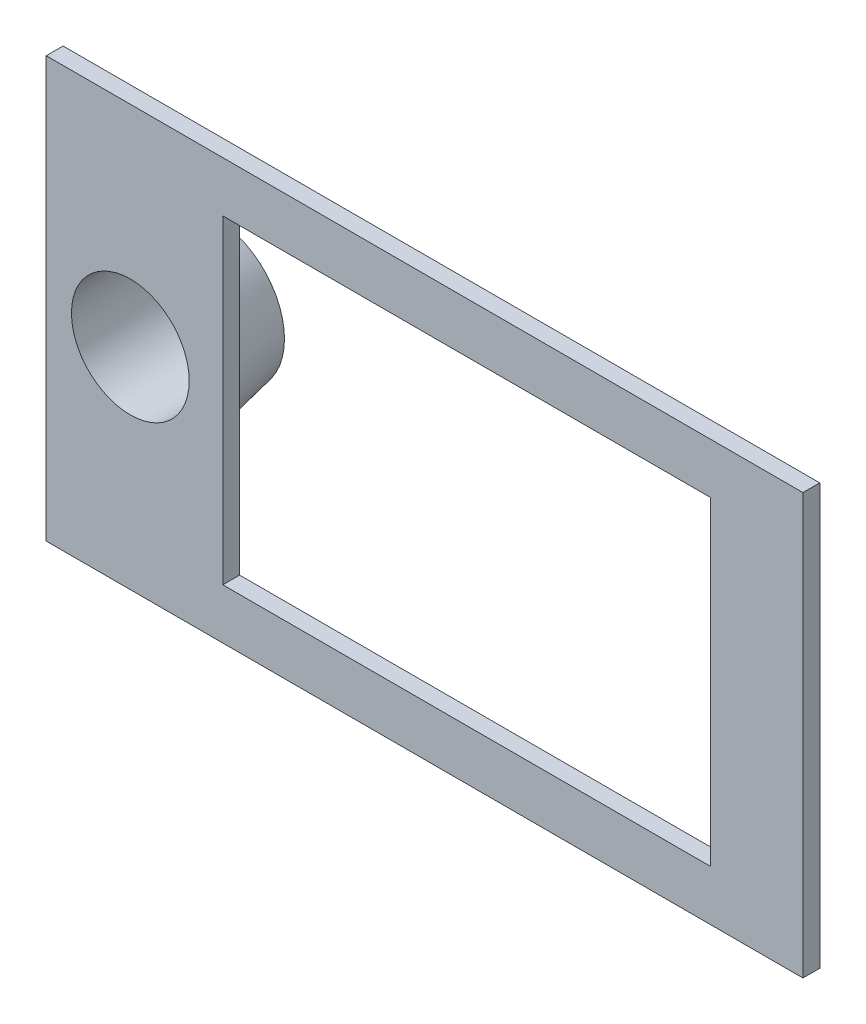
ISO-10303-21;
HEADER;
FILE_DESCRIPTION(('STEP AP214'),'2;1');
FILE_NAME('part.step','',(''),(''),'','','');
FILE_SCHEMA(('AUTOMOTIVE_DESIGN { 1 0 10303 214 1 1 1 1 }'));
ENDSEC;
DATA;
#1=APPLICATION_CONTEXT('core data for automotive mechanical design processes');
#2=APPLICATION_PROTOCOL_DEFINITION('international standard','automotive_design',2000,#1);
#3=PRODUCT_CONTEXT('',#1,'mechanical');
#4=PRODUCT('Part','Part','',(#3));
#5=PRODUCT_RELATED_PRODUCT_CATEGORY('part','',(#4));
#6=PRODUCT_DEFINITION_FORMATION('','',#4);
#7=PRODUCT_DEFINITION_CONTEXT('part definition',#1,'design');
#8=PRODUCT_DEFINITION('design','',#6,#7);
#9=PRODUCT_DEFINITION_SHAPE('','',#8);
#10=(LENGTH_UNIT() NAMED_UNIT(*) SI_UNIT(.MILLI.,.METRE.));
#11=(NAMED_UNIT(*) PLANE_ANGLE_UNIT() SI_UNIT($,.RADIAN.));
#12=(NAMED_UNIT(*) SI_UNIT($,.STERADIAN.) SOLID_ANGLE_UNIT());
#13=UNCERTAINTY_MEASURE_WITH_UNIT(LENGTH_MEASURE(1.E-05),#10,'distance_accuracy_value','');
#14=(GEOMETRIC_REPRESENTATION_CONTEXT(3) GLOBAL_UNCERTAINTY_ASSIGNED_CONTEXT((#13)) GLOBAL_UNIT_ASSIGNED_CONTEXT((#10,
#11,#12)) REPRESENTATION_CONTEXT('',''));
#15=CARTESIAN_POINT('',(0.,0.,0.));
#16=DIRECTION('',(0.,0.,1.));
#17=DIRECTION('',(1.,0.,0.));
#18=AXIS2_PLACEMENT_3D('',#15,#16,#17);
#19=CARTESIAN_POINT('',(0.,0.,899.944534425871));
#20=DIRECTION('',(0.,0.,-1.));
#21=DIRECTION('',(-1.,0.,0.));
#22=AXIS2_PLACEMENT_3D('',#19,#20,#21);
#23=PLANE('',#22);
#24=DIRECTION('',(-1.,0.,0.));
#25=VECTOR('',#24,1.);
#26=CARTESIAN_POINT('',(136.5,5.99999999999999,899.944534425871));
#27=LINE('',#26,#25);
#28=CARTESIAN_POINT('',(136.5,5.99999999999999,899.944534425871));
#29=VERTEX_POINT('',#28);
#30=CARTESIAN_POINT('',(49.5,5.99999999999999,899.944534425871));
#31=VERTEX_POINT('',#30);
#32=EDGE_CURVE('E121',#29,#31,#27,.T.);
#33=ORIENTED_EDGE('',*,*,#32,.F.);
#34=DIRECTION('',(0.,-1.,0.));
#35=VECTOR('',#34,1.);
#36=CARTESIAN_POINT('',(136.5,63.,899.944534425871));
#37=LINE('',#36,#35);
#38=CARTESIAN_POINT('',(136.5,63.,899.944534425871));
#39=VERTEX_POINT('',#38);
#40=EDGE_CURVE('E111',#39,#29,#37,.T.);
#41=ORIENTED_EDGE('',*,*,#40,.F.);
#42=DIRECTION('',(1.,0.,0.));
#43=VECTOR('',#42,1.);
#44=CARTESIAN_POINT('',(136.5,63.,899.944534425871));
#45=LINE('',#44,#43);
#46=CARTESIAN_POINT('',(49.5,63.,899.944534425871));
#47=VERTEX_POINT('',#46);
#48=EDGE_CURVE('E136',#47,#39,#45,.T.);
#49=ORIENTED_EDGE('',*,*,#48,.F.);
#50=DIRECTION('',(0.,1.,0.));
#51=VECTOR('',#50,1.);
#52=CARTESIAN_POINT('',(49.5,63.,899.944534425871));
#53=LINE('',#52,#51);
#54=EDGE_CURVE('E134',#31,#47,#53,.T.);
#55=ORIENTED_EDGE('',*,*,#54,.F.);
#56=EDGE_LOOP('',(#33,#41,#49,#55));
#57=FACE_BOUND('',#56,.T.);
#58=DIRECTION('',(0.,1.,0.));
#59=VECTOR('',#58,1.);
#60=CARTESIAN_POINT('',(18.,72.,899.944534425871));
#61=LINE('',#60,#59);
#62=CARTESIAN_POINT('',(18.,-3.,899.944534425871));
#63=VERTEX_POINT('',#62);
#64=CARTESIAN_POINT('',(18.,34.5,899.944534425871));
#65=VERTEX_POINT('',#64);
#66=EDGE_CURVE('E167',#63,#65,#61,.T.);
#67=ORIENTED_EDGE('',*,*,#66,.T.);
#68=CARTESIAN_POINT('',(33.,34.5,899.944534425871));
#69=DIRECTION('',(0.,0.,-1.));
#70=DIRECTION('',(-1.,0.,0.));
#71=AXIS2_PLACEMENT_3D('',#68,#69,#70);
#72=CIRCLE('',#71,15.);
#73=EDGE_CURVE('E56',#65,#65,#72,.T.);
#74=ORIENTED_EDGE('',*,*,#73,.F.);
#75=CARTESIAN_POINT('',(18.,72.,899.944534425871));
#76=VERTEX_POINT('',#75);
#77=EDGE_CURVE('E159',#65,#76,#61,.T.);
#78=ORIENTED_EDGE('',*,*,#77,.T.);
#79=DIRECTION('',(1.,0.,0.));
#80=VECTOR('',#79,1.);
#81=CARTESIAN_POINT('',(153.,72.,899.944534425871));
#82=LINE('',#81,#80);
#83=CARTESIAN_POINT('',(153.,72.,899.944534425871));
#84=VERTEX_POINT('',#83);
#85=EDGE_CURVE('E162',#76,#84,#82,.T.);
#86=ORIENTED_EDGE('',*,*,#85,.T.);
#87=DIRECTION('',(0.,-1.,0.));
#88=VECTOR('',#87,1.);
#89=CARTESIAN_POINT('',(153.,72.,899.944534425871));
#90=LINE('',#89,#88);
#91=CARTESIAN_POINT('',(153.,-3.,899.944534425871));
#92=VERTEX_POINT('',#91);
#93=EDGE_CURVE('E153',#84,#92,#90,.T.);
#94=ORIENTED_EDGE('',*,*,#93,.T.);
#95=DIRECTION('',(-1.,0.,0.));
#96=VECTOR('',#95,1.);
#97=CARTESIAN_POINT('',(153.,-3.,899.944534425871));
#98=LINE('',#97,#96);
#99=EDGE_CURVE('E156',#92,#63,#98,.T.);
#100=ORIENTED_EDGE('',*,*,#99,.T.);
#101=EDGE_LOOP('',(#67,#74,#78,#86,#94,#100));
#102=FACE_BOUND('',#101,.T.);
#103=ADVANCED_FACE('F41',(#57,#102),#23,.T.);
#104=CARTESIAN_POINT('',(0.,0.,902.944534425871));
#105=DIRECTION('',(0.,0.,-1.));
#106=DIRECTION('',(-1.,0.,0.));
#107=AXIS2_PLACEMENT_3D('',#104,#105,#106);
#108=PLANE('',#107);
#109=DIRECTION('',(0.,-1.,0.));
#110=VECTOR('',#109,1.);
#111=CARTESIAN_POINT('',(153.,72.,902.944534425871));
#112=LINE('',#111,#110);
#113=CARTESIAN_POINT('',(153.,72.,902.944534425871));
#114=VERTEX_POINT('',#113);
#115=CARTESIAN_POINT('',(153.,-3.,902.944534425871));
#116=VERTEX_POINT('',#115);
#117=EDGE_CURVE('E129',#114,#116,#112,.T.);
#118=ORIENTED_EDGE('',*,*,#117,.F.);
#119=DIRECTION('',(1.,0.,0.));
#120=VECTOR('',#119,1.);
#121=CARTESIAN_POINT('',(153.,72.,902.944534425871));
#122=LINE('',#121,#120);
#123=CARTESIAN_POINT('',(18.,72.,902.944534425871));
#124=VERTEX_POINT('',#123);
#125=EDGE_CURVE('E157',#124,#114,#122,.T.);
#126=ORIENTED_EDGE('',*,*,#125,.F.);
#127=DIRECTION('',(0.,1.,0.));
#128=VECTOR('',#127,1.);
#129=CARTESIAN_POINT('',(18.,72.,902.944534425871));
#130=LINE('',#129,#128);
#131=CARTESIAN_POINT('',(18.,-3.,902.944534425871));
#132=VERTEX_POINT('',#131);
#133=EDGE_CURVE('E254',#132,#124,#130,.T.);
#134=ORIENTED_EDGE('',*,*,#133,.F.);
#135=DIRECTION('',(-1.,0.,0.));
#136=VECTOR('',#135,1.);
#137=CARTESIAN_POINT('',(153.,-3.,902.944534425871));
#138=LINE('',#137,#136);
#139=EDGE_CURVE('E247',#116,#132,#138,.T.);
#140=ORIENTED_EDGE('',*,*,#139,.F.);
#141=EDGE_LOOP('',(#118,#126,#134,#140));
#142=FACE_BOUND('',#141,.T.);
#143=DIRECTION('',(0.,-1.,0.));
#144=VECTOR('',#143,1.);
#145=CARTESIAN_POINT('',(136.5,63.,902.944534425871));
#146=LINE('',#145,#144);
#147=CARTESIAN_POINT('',(136.5,63.,902.944534425871));
#148=VERTEX_POINT('',#147);
#149=CARTESIAN_POINT('',(136.5,5.99999999999999,902.944534425871));
#150=VERTEX_POINT('',#149);
#151=EDGE_CURVE('E141',#148,#150,#146,.T.);
#152=ORIENTED_EDGE('',*,*,#151,.T.);
#153=DIRECTION('',(-1.,0.,0.));
#154=VECTOR('',#153,1.);
#155=CARTESIAN_POINT('',(136.5,5.99999999999999,902.944534425871));
#156=LINE('',#155,#154);
#157=CARTESIAN_POINT('',(49.5,5.99999999999999,902.944534425871));
#158=VERTEX_POINT('',#157);
#159=EDGE_CURVE('E128',#150,#158,#156,.T.);
#160=ORIENTED_EDGE('',*,*,#159,.T.);
#161=DIRECTION('',(0.,1.,0.));
#162=VECTOR('',#161,1.);
#163=CARTESIAN_POINT('',(49.5,63.,902.944534425871));
#164=LINE('',#163,#162);
#165=CARTESIAN_POINT('',(49.5,63.,902.944534425871));
#166=VERTEX_POINT('',#165);
#167=EDGE_CURVE('E145',#158,#166,#164,.T.);
#168=ORIENTED_EDGE('',*,*,#167,.T.);
#169=DIRECTION('',(1.,0.,0.));
#170=VECTOR('',#169,1.);
#171=CARTESIAN_POINT('',(136.5,63.,902.944534425871));
#172=LINE('',#171,#170);
#173=EDGE_CURVE('E122',#166,#148,#172,.T.);
#174=ORIENTED_EDGE('',*,*,#173,.T.);
#175=EDGE_LOOP('',(#152,#160,#168,#174));
#176=FACE_BOUND('',#175,.T.);
#177=CARTESIAN_POINT('',(33.,34.5,902.944534425871));
#178=DIRECTION('',(0.,0.,-1.));
#179=DIRECTION('',(-1.,0.,0.));
#180=AXIS2_PLACEMENT_3D('',#177,#178,#179);
#181=CIRCLE('',#180,10.5);
#182=CARTESIAN_POINT('',(22.5,34.5,902.944534425871));
#183=VERTEX_POINT('',#182);
#184=EDGE_CURVE('E143',#183,#183,#181,.T.);
#185=ORIENTED_EDGE('',*,*,#184,.T.);
#186=EDGE_LOOP('',(#185));
#187=FACE_BOUND('',#186,.T.);
#188=ADVANCED_FACE('F213',(#142,#176,#187),#108,.F.);
#189=CARTESIAN_POINT('',(153.,72.,899.944534425871));
#190=DIRECTION('',(-1.,0.,0.));
#191=DIRECTION('',(0.,0.,1.));
#192=AXIS2_PLACEMENT_3D('',#189,#190,#191);
#193=PLANE('',#192);
#194=ORIENTED_EDGE('',*,*,#117,.T.);
#195=DIRECTION('',(0.,0.,1.));
#196=VECTOR('',#195,1.);
#197=CARTESIAN_POINT('',(153.,-3.,899.944534425871));
#198=LINE('',#197,#196);
#199=EDGE_CURVE('E12',#92,#116,#198,.T.);
#200=ORIENTED_EDGE('',*,*,#199,.F.);
#201=ORIENTED_EDGE('',*,*,#93,.F.);
#202=DIRECTION('',(0.,0.,1.));
#203=VECTOR('',#202,1.);
#204=CARTESIAN_POINT('',(153.,72.,899.944534425871));
#205=LINE('',#204,#203);
#206=EDGE_CURVE('E266',#84,#114,#205,.T.);
#207=ORIENTED_EDGE('',*,*,#206,.T.);
#208=EDGE_LOOP('',(#194,#200,#201,#207));
#209=FACE_BOUND('',#208,.T.);
#210=ADVANCED_FACE('F43',(#209),#193,.F.);
#211=CARTESIAN_POINT('',(153.,-3.,899.944534425871));
#212=DIRECTION('',(0.,1.,0.));
#213=DIRECTION('',(0.,0.,1.));
#214=AXIS2_PLACEMENT_3D('',#211,#212,#213);
#215=PLANE('',#214);
#216=ORIENTED_EDGE('',*,*,#139,.T.);
#217=DIRECTION('',(0.,0.,1.));
#218=VECTOR('',#217,1.);
#219=CARTESIAN_POINT('',(18.,-3.,899.944534425871));
#220=LINE('',#219,#218);
#221=EDGE_CURVE('E50',#63,#132,#220,.T.);
#222=ORIENTED_EDGE('',*,*,#221,.F.);
#223=ORIENTED_EDGE('',*,*,#99,.F.);
#224=ORIENTED_EDGE('',*,*,#199,.T.);
#225=EDGE_LOOP('',(#216,#222,#223,#224));
#226=FACE_BOUND('',#225,.T.);
#227=ADVANCED_FACE('F238',(#226),#215,.F.);
#228=CARTESIAN_POINT('',(18.,72.,899.944534425871));
#229=DIRECTION('',(1.,0.,0.));
#230=DIRECTION('',(0.,0.,-1.));
#231=AXIS2_PLACEMENT_3D('',#228,#229,#230);
#232=PLANE('',#231);
#233=ORIENTED_EDGE('',*,*,#133,.T.);
#234=DIRECTION('',(0.,0.,1.));
#235=VECTOR('',#234,1.);
#236=CARTESIAN_POINT('',(18.,72.,899.944534425871));
#237=LINE('',#236,#235);
#238=EDGE_CURVE('E259',#76,#124,#237,.T.);
#239=ORIENTED_EDGE('',*,*,#238,.F.);
#240=ORIENTED_EDGE('',*,*,#77,.F.);
#241=ORIENTED_EDGE('',*,*,#66,.F.);
#242=ORIENTED_EDGE('',*,*,#221,.T.);
#243=EDGE_LOOP('',(#233,#239,#240,#241,#242));
#244=FACE_BOUND('',#243,.T.);
#245=ADVANCED_FACE('F235',(#244),#232,.F.);
#246=CARTESIAN_POINT('',(153.,72.,899.944534425871));
#247=DIRECTION('',(0.,-1.,0.));
#248=DIRECTION('',(0.,0.,-1.));
#249=AXIS2_PLACEMENT_3D('',#246,#247,#248);
#250=PLANE('',#249);
#251=ORIENTED_EDGE('',*,*,#125,.T.);
#252=ORIENTED_EDGE('',*,*,#206,.F.);
#253=ORIENTED_EDGE('',*,*,#85,.F.);
#254=ORIENTED_EDGE('',*,*,#238,.T.);
#255=EDGE_LOOP('',(#251,#252,#253,#254));
#256=FACE_BOUND('',#255,.T.);
#257=ADVANCED_FACE('F232',(#256),#250,.F.);
#258=CARTESIAN_POINT('',(136.5,63.,899.944534425871));
#259=DIRECTION('',(-1.,0.,0.));
#260=DIRECTION('',(0.,0.,1.));
#261=AXIS2_PLACEMENT_3D('',#258,#259,#260);
#262=PLANE('',#261);
#263=ORIENTED_EDGE('',*,*,#151,.F.);
#264=DIRECTION('',(0.,0.,1.));
#265=VECTOR('',#264,1.);
#266=CARTESIAN_POINT('',(136.5,63.,899.944534425871));
#267=LINE('',#266,#265);
#268=EDGE_CURVE('E117',#39,#148,#267,.T.);
#269=ORIENTED_EDGE('',*,*,#268,.F.);
#270=ORIENTED_EDGE('',*,*,#40,.T.);
#271=DIRECTION('',(0.,0.,1.));
#272=VECTOR('',#271,1.);
#273=CARTESIAN_POINT('',(136.5,5.99999999999999,899.944534425871));
#274=LINE('',#273,#272);
#275=EDGE_CURVE('E114',#29,#150,#274,.T.);
#276=ORIENTED_EDGE('',*,*,#275,.T.);
#277=EDGE_LOOP('',(#263,#269,#270,#276));
#278=FACE_BOUND('',#277,.T.);
#279=ADVANCED_FACE('F113',(#278),#262,.T.);
#280=CARTESIAN_POINT('',(136.5,5.99999999999999,899.944534425871));
#281=DIRECTION('',(0.,1.,0.));
#282=DIRECTION('',(0.,0.,1.));
#283=AXIS2_PLACEMENT_3D('',#280,#281,#282);
#284=PLANE('',#283);
#285=ORIENTED_EDGE('',*,*,#159,.F.);
#286=ORIENTED_EDGE('',*,*,#275,.F.);
#287=ORIENTED_EDGE('',*,*,#32,.T.);
#288=DIRECTION('',(0.,0.,1.));
#289=VECTOR('',#288,1.);
#290=CARTESIAN_POINT('',(49.5,5.99999999999999,899.944534425871));
#291=LINE('',#290,#289);
#292=EDGE_CURVE('E130',#31,#158,#291,.T.);
#293=ORIENTED_EDGE('',*,*,#292,.T.);
#294=EDGE_LOOP('',(#285,#286,#287,#293));
#295=FACE_BOUND('',#294,.T.);
#296=ADVANCED_FACE('F125',(#295),#284,.T.);
#297=CARTESIAN_POINT('',(49.5,63.,899.944534425871));
#298=DIRECTION('',(1.,0.,0.));
#299=DIRECTION('',(0.,0.,-1.));
#300=AXIS2_PLACEMENT_3D('',#297,#298,#299);
#301=PLANE('',#300);
#302=ORIENTED_EDGE('',*,*,#167,.F.);
#303=ORIENTED_EDGE('',*,*,#292,.F.);
#304=ORIENTED_EDGE('',*,*,#54,.T.);
#305=DIRECTION('',(0.,0.,1.));
#306=VECTOR('',#305,1.);
#307=CARTESIAN_POINT('',(49.5,63.,899.944534425871));
#308=LINE('',#307,#306);
#309=EDGE_CURVE('E63',#47,#166,#308,.T.);
#310=ORIENTED_EDGE('',*,*,#309,.T.);
#311=EDGE_LOOP('',(#302,#303,#304,#310));
#312=FACE_BOUND('',#311,.T.);
#313=ADVANCED_FACE('F221',(#312),#301,.T.);
#314=CARTESIAN_POINT('',(136.5,63.,899.944534425871));
#315=DIRECTION('',(0.,-1.,0.));
#316=DIRECTION('',(0.,0.,-1.));
#317=AXIS2_PLACEMENT_3D('',#314,#315,#316);
#318=PLANE('',#317);
#319=ORIENTED_EDGE('',*,*,#173,.F.);
#320=ORIENTED_EDGE('',*,*,#309,.F.);
#321=ORIENTED_EDGE('',*,*,#48,.T.);
#322=ORIENTED_EDGE('',*,*,#268,.T.);
#323=EDGE_LOOP('',(#319,#320,#321,#322));
#324=FACE_BOUND('',#323,.T.);
#325=ADVANCED_FACE('F217',(#324),#318,.T.);
#326=CARTESIAN_POINT('',(33.,34.5,899.944534425871));
#327=DIRECTION('',(0.,0.,1.));
#328=DIRECTION('',(1.,0.,0.));
#329=AXIS2_PLACEMENT_3D('',#326,#327,#328);
#330=CYLINDRICAL_SURFACE('',#329,10.5);
#331=ORIENTED_EDGE('',*,*,#184,.F.);
#332=EDGE_LOOP('',(#331));
#333=FACE_BOUND('',#332,.T.);
#334=CARTESIAN_POINT('',(33.,34.5,887.944534425871));
#335=DIRECTION('',(0.,0.,1.));
#336=DIRECTION('',(1.,0.,0.));
#337=AXIS2_PLACEMENT_3D('',#334,#335,#336);
#338=CIRCLE('',#337,10.5);
#339=CARTESIAN_POINT('',(43.5,34.5,887.944534425871));
#340=VERTEX_POINT('',#339);
#341=EDGE_CURVE('E170',#340,#340,#338,.T.);
#342=ORIENTED_EDGE('',*,*,#341,.F.);
#343=EDGE_LOOP('',(#342));
#344=FACE_BOUND('',#343,.T.);
#345=ADVANCED_FACE('F196',(#333,#344),#330,.F.);
#346=CARTESIAN_POINT('',(33.,34.5,887.944534425871));
#347=DIRECTION('',(0.,0.,1.));
#348=DIRECTION('',(1.,0.,0.));
#349=AXIS2_PLACEMENT_3D('',#346,#347,#348);
#350=CONICAL_SURFACE('',#349,12.5,0.205395389189768);
#351=ORIENTED_EDGE('',*,*,#73,.T.);
#352=EDGE_LOOP('',(#351));
#353=FACE_BOUND('',#352,.T.);
#354=CARTESIAN_POINT('',(33.,34.5,887.944534425871));
#355=DIRECTION('',(0.,0.,1.));
#356=DIRECTION('',(1.,0.,0.));
#357=AXIS2_PLACEMENT_3D('',#354,#355,#356);
#358=CIRCLE('',#357,12.5);
#359=CARTESIAN_POINT('',(45.5,34.5,887.944534425871));
#360=VERTEX_POINT('',#359);
#361=EDGE_CURVE('E169',#360,#360,#358,.T.);
#362=ORIENTED_EDGE('',*,*,#361,.T.);
#363=EDGE_LOOP('',(#362));
#364=FACE_BOUND('',#363,.T.);
#365=ADVANCED_FACE('F186',(#353,#364),#350,.T.);
#366=CARTESIAN_POINT('',(33.,34.5,887.944534425871));
#367=DIRECTION('',(0.,0.,1.));
#368=DIRECTION('',(1.,0.,0.));
#369=AXIS2_PLACEMENT_3D('',#366,#367,#368);
#370=PLANE('',#369);
#371=ORIENTED_EDGE('',*,*,#341,.T.);
#372=EDGE_LOOP('',(#371));
#373=FACE_BOUND('',#372,.T.);
#374=ORIENTED_EDGE('',*,*,#361,.F.);
#375=EDGE_LOOP('',(#374));
#376=FACE_BOUND('',#375,.T.);
#377=ADVANCED_FACE('F195',(#373,#376),#370,.F.);
#378=CLOSED_SHELL('',(#103,#188,#210,#227,#245,#257,#279,#296,#313,#325,#345,#365,#377));
#379=MANIFOLD_SOLID_BREP('B2',#378);
#380=ADVANCED_BREP_SHAPE_REPRESENTATION('',(#18,#379),#14);
#381=SHAPE_DEFINITION_REPRESENTATION(#9,#380);
ENDSEC;
END-ISO-10303-21;
